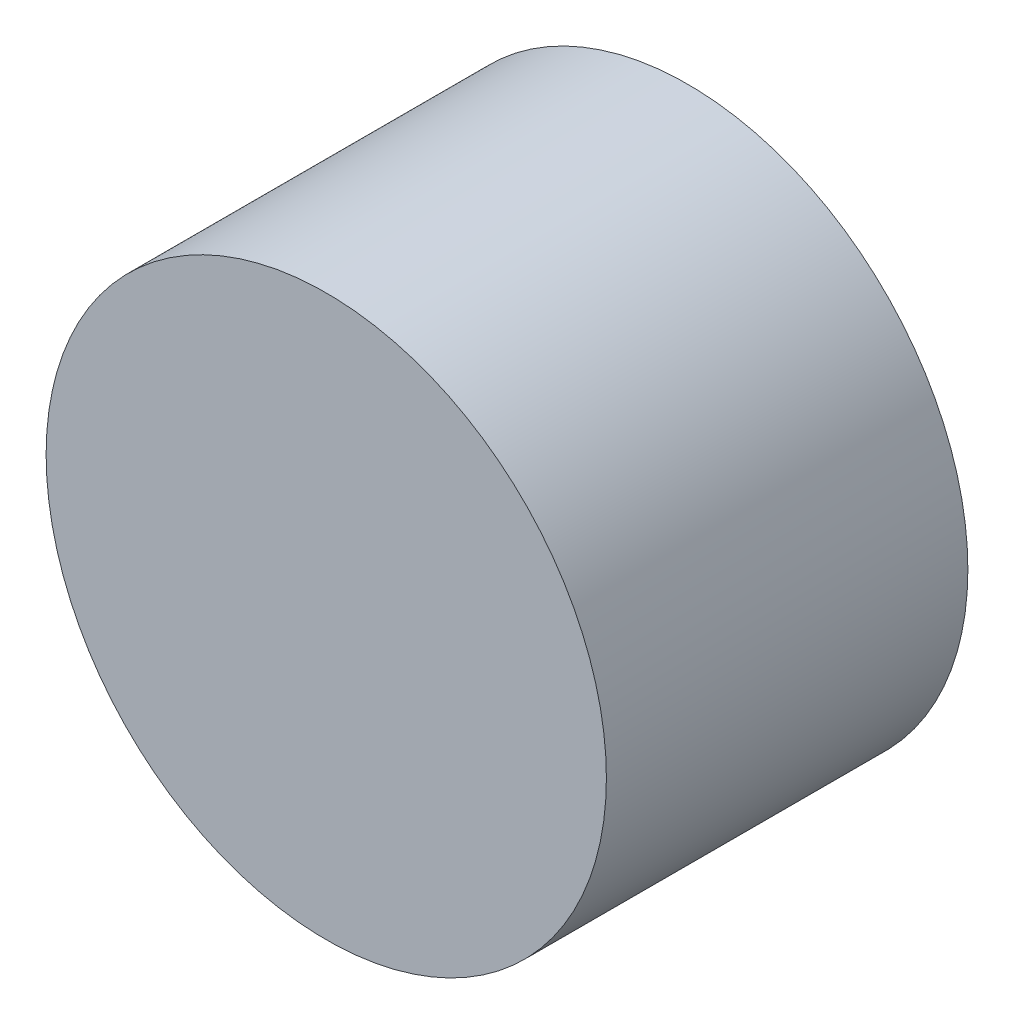
ISO-10303-21;
HEADER;
FILE_DESCRIPTION(('STEP AP214'),'2;1');
FILE_NAME('part.step','',(''),(''),'','','');
FILE_SCHEMA(('AUTOMOTIVE_DESIGN { 1 0 10303 214 1 1 1 1 }'));
ENDSEC;
DATA;
#1=APPLICATION_CONTEXT('core data for automotive mechanical design processes');
#2=APPLICATION_PROTOCOL_DEFINITION('international standard','automotive_design',2000,#1);
#3=PRODUCT_CONTEXT('',#1,'mechanical');
#4=PRODUCT('Part','Part','',(#3));
#5=PRODUCT_RELATED_PRODUCT_CATEGORY('part','',(#4));
#6=PRODUCT_DEFINITION_FORMATION('','',#4);
#7=PRODUCT_DEFINITION_CONTEXT('part definition',#1,'design');
#8=PRODUCT_DEFINITION('design','',#6,#7);
#9=PRODUCT_DEFINITION_SHAPE('','',#8);
#10=(LENGTH_UNIT() NAMED_UNIT(*) SI_UNIT(.MILLI.,.METRE.));
#11=(NAMED_UNIT(*) PLANE_ANGLE_UNIT() SI_UNIT($,.RADIAN.));
#12=(NAMED_UNIT(*) SI_UNIT($,.STERADIAN.) SOLID_ANGLE_UNIT());
#13=UNCERTAINTY_MEASURE_WITH_UNIT(LENGTH_MEASURE(1.E-05),#10,'distance_accuracy_value','');
#14=(GEOMETRIC_REPRESENTATION_CONTEXT(3) GLOBAL_UNCERTAINTY_ASSIGNED_CONTEXT((#13)) GLOBAL_UNIT_ASSIGNED_CONTEXT((#10,
#11,#12)) REPRESENTATION_CONTEXT('',''));
#15=CARTESIAN_POINT('',(0.,0.,0.));
#16=DIRECTION('',(0.,0.,1.));
#17=DIRECTION('',(1.,0.,0.));
#18=AXIS2_PLACEMENT_3D('',#15,#16,#17);
#19=CARTESIAN_POINT('',(0.,0.,30.));
#20=DIRECTION('',(0.,0.,-1.));
#21=DIRECTION('',(-1.,0.,0.));
#22=AXIS2_PLACEMENT_3D('',#19,#20,#21);
#23=CYLINDRICAL_SURFACE('',#22,23.25);
#24=CARTESIAN_POINT('',(0.,0.,30.));
#25=DIRECTION('',(0.,0.,1.));
#26=DIRECTION('',(1.,0.,0.));
#27=AXIS2_PLACEMENT_3D('',#24,#25,#26);
#28=CIRCLE('',#27,23.25);
#29=CARTESIAN_POINT('',(23.25,0.,30.));
#30=VERTEX_POINT('',#29);
#31=EDGE_CURVE('E10',#30,#30,#28,.T.);
#32=ORIENTED_EDGE('',*,*,#31,.F.);
#33=EDGE_LOOP('',(#32));
#34=FACE_BOUND('',#33,.T.);
#35=CARTESIAN_POINT('',(0.,0.,0.));
#36=DIRECTION('',(0.,0.,1.));
#37=DIRECTION('',(1.,0.,0.));
#38=AXIS2_PLACEMENT_3D('',#35,#36,#37);
#39=CIRCLE('',#38,23.25);
#40=CARTESIAN_POINT('',(23.25,0.,0.));
#41=VERTEX_POINT('',#40);
#42=EDGE_CURVE('E40',#41,#41,#39,.T.);
#43=ORIENTED_EDGE('',*,*,#42,.T.);
#44=EDGE_LOOP('',(#43));
#45=FACE_BOUND('',#44,.T.);
#46=ADVANCED_FACE('F37',(#34,#45),#23,.T.);
#47=CARTESIAN_POINT('',(0.,0.,30.));
#48=DIRECTION('',(0.,0.,1.));
#49=DIRECTION('',(1.,0.,0.));
#50=AXIS2_PLACEMENT_3D('',#47,#48,#49);
#51=PLANE('',#50);
#52=ORIENTED_EDGE('',*,*,#31,.T.);
#53=EDGE_LOOP('',(#52));
#54=FACE_BOUND('',#53,.T.);
#55=ADVANCED_FACE('F54',(#54),#51,.T.);
#56=CARTESIAN_POINT('',(0.,0.,0.));
#57=DIRECTION('',(0.,0.,1.));
#58=DIRECTION('',(1.,0.,0.));
#59=AXIS2_PLACEMENT_3D('',#56,#57,#58);
#60=PLANE('',#59);
#61=ORIENTED_EDGE('',*,*,#42,.F.);
#62=EDGE_LOOP('',(#61));
#63=FACE_BOUND('',#62,.T.);
#64=ADVANCED_FACE('F52',(#63),#60,.F.);
#65=CLOSED_SHELL('',(#46,#55,#64));
#66=MANIFOLD_SOLID_BREP('B2',#65);
#67=ADVANCED_BREP_SHAPE_REPRESENTATION('',(#18,#66),#14);
#68=SHAPE_DEFINITION_REPRESENTATION(#9,#67);
ENDSEC;
END-ISO-10303-21;
